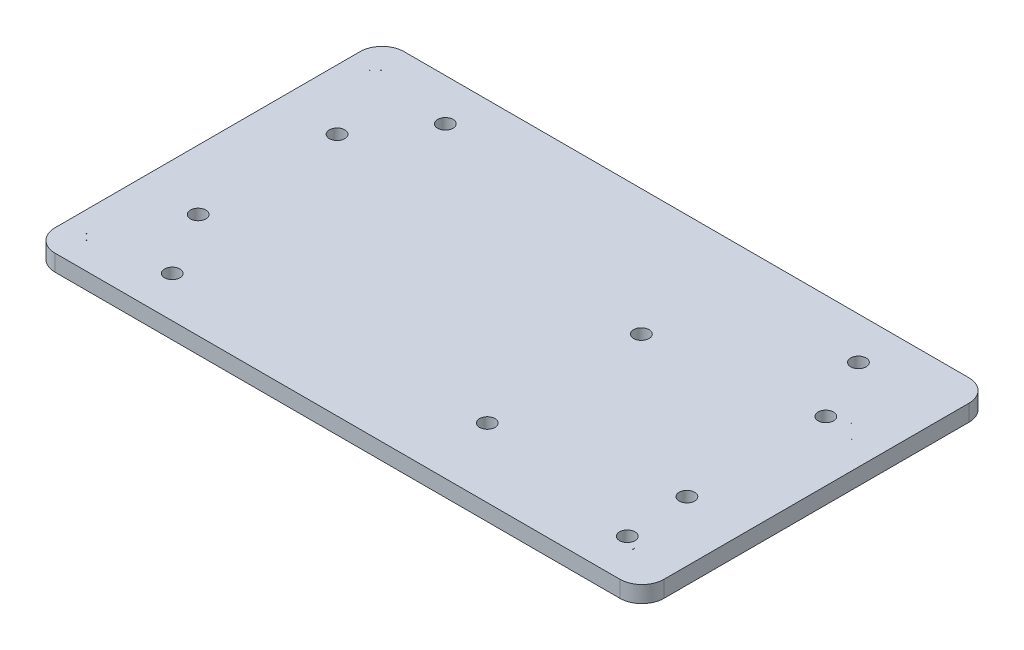
ISO-10303-21;
HEADER;
FILE_DESCRIPTION(('STEP AP214'),'2;1');
FILE_NAME('part.step','',(''),(''),'','','');
FILE_SCHEMA(('AUTOMOTIVE_DESIGN { 1 0 10303 214 1 1 1 1 }'));
ENDSEC;
DATA;
#1=APPLICATION_CONTEXT('core data for automotive mechanical design processes');
#2=APPLICATION_PROTOCOL_DEFINITION('international standard','automotive_design',2000,#1);
#3=PRODUCT_CONTEXT('',#1,'mechanical');
#4=PRODUCT('Part','Part','',(#3));
#5=PRODUCT_RELATED_PRODUCT_CATEGORY('part','',(#4));
#6=PRODUCT_DEFINITION_FORMATION('','',#4);
#7=PRODUCT_DEFINITION_CONTEXT('part definition',#1,'design');
#8=PRODUCT_DEFINITION('design','',#6,#7);
#9=PRODUCT_DEFINITION_SHAPE('','',#8);
#10=(LENGTH_UNIT() NAMED_UNIT(*) SI_UNIT(.MILLI.,.METRE.));
#11=(NAMED_UNIT(*) PLANE_ANGLE_UNIT() SI_UNIT($,.RADIAN.));
#12=(NAMED_UNIT(*) SI_UNIT($,.STERADIAN.) SOLID_ANGLE_UNIT());
#13=UNCERTAINTY_MEASURE_WITH_UNIT(LENGTH_MEASURE(1.E-05),#10,'distance_accuracy_value','');
#14=(GEOMETRIC_REPRESENTATION_CONTEXT(3) GLOBAL_UNCERTAINTY_ASSIGNED_CONTEXT((#13)) GLOBAL_UNIT_ASSIGNED_CONTEXT((#10,
#11,#12)) REPRESENTATION_CONTEXT('',''));
#15=CARTESIAN_POINT('',(0.,0.,0.));
#16=DIRECTION('',(0.,0.,1.));
#17=DIRECTION('',(1.,0.,0.));
#18=AXIS2_PLACEMENT_3D('',#15,#16,#17);
#19=CARTESIAN_POINT('',(-36.1275731391276,3.,0.));
#20=DIRECTION('',(1.,0.,0.));
#21=DIRECTION('',(0.,0.,-1.));
#22=AXIS2_PLACEMENT_3D('',#19,#20,#21);
#23=PLANE('',#22);
#24=DIRECTION('',(0.,0.,1.));
#25=VECTOR('',#24,1.);
#26=CARTESIAN_POINT('',(-36.1275731391276,0.,0.));
#27=LINE('',#26,#25);
#28=CARTESIAN_POINT('',(-36.1275731391276,0.,-87.0737122646059));
#29=VERTEX_POINT('',#28);
#30=CARTESIAN_POINT('',(-36.1275731391276,0.,-31.7737122646059));
#31=VERTEX_POINT('',#30);
#32=EDGE_CURVE('E260',#29,#31,#27,.T.);
#33=ORIENTED_EDGE('',*,*,#32,.T.);
#34=DIRECTION('',(0.,-1.,0.));
#35=VECTOR('',#34,1.);
#36=CARTESIAN_POINT('',(-36.1275731391276,3.,-31.7737122646059));
#37=LINE('',#36,#35);
#38=CARTESIAN_POINT('',(-36.1275731391276,3.,-31.7737122646059));
#39=VERTEX_POINT('',#38);
#40=EDGE_CURVE('E11',#39,#31,#37,.T.);
#41=ORIENTED_EDGE('',*,*,#40,.F.);
#42=DIRECTION('',(0.,0.,1.));
#43=VECTOR('',#42,1.);
#44=CARTESIAN_POINT('',(-36.1275731391276,3.,0.));
#45=LINE('',#44,#43);
#46=CARTESIAN_POINT('',(-36.1275731391276,3.,-87.0737122646059));
#47=VERTEX_POINT('',#46);
#48=EDGE_CURVE('E456',#47,#39,#45,.T.);
#49=ORIENTED_EDGE('',*,*,#48,.F.);
#50=DIRECTION('',(0.,-1.,0.));
#51=VECTOR('',#50,1.);
#52=CARTESIAN_POINT('',(-36.1275731391276,3.,-87.0737122646059));
#53=LINE('',#52,#51);
#54=EDGE_CURVE('E309',#47,#29,#53,.T.);
#55=ORIENTED_EDGE('',*,*,#54,.T.);
#56=EDGE_LOOP('',(#33,#41,#49,#55));
#57=FACE_BOUND('',#56,.T.);
#58=ADVANCED_FACE('F35',(#57),#23,.F.);
#59=CARTESIAN_POINT('',(-32.1275731391276,3.,-31.7737122646059));
#60=DIRECTION('',(0.,-1.,0.));
#61=DIRECTION('',(0.,0.,-1.));
#62=AXIS2_PLACEMENT_3D('',#59,#60,#61);
#63=CYLINDRICAL_SURFACE('',#62,4.00000000000001);
#64=CARTESIAN_POINT('',(-32.1275731391276,0.,-31.7737122646059));
#65=DIRECTION('',(0.,1.,0.));
#66=DIRECTION('',(0.,0.,1.));
#67=AXIS2_PLACEMENT_3D('',#64,#65,#66);
#68=CIRCLE('',#67,4.00000000000001);
#69=CARTESIAN_POINT('',(-32.1275731391276,0.,-27.7737122646059));
#70=VERTEX_POINT('',#69);
#71=EDGE_CURVE('E263',#31,#70,#68,.T.);
#72=ORIENTED_EDGE('',*,*,#71,.T.);
#73=DIRECTION('',(0.,-1.,0.));
#74=VECTOR('',#73,1.);
#75=CARTESIAN_POINT('',(-32.1275731391276,3.,-27.7737122646059));
#76=LINE('',#75,#74);
#77=CARTESIAN_POINT('',(-32.1275731391276,3.,-27.7737122646059));
#78=VERTEX_POINT('',#77);
#79=EDGE_CURVE('E45',#78,#70,#76,.T.);
#80=ORIENTED_EDGE('',*,*,#79,.F.);
#81=CARTESIAN_POINT('',(-32.1275731391276,3.,-31.7737122646059));
#82=DIRECTION('',(0.,1.,0.));
#83=DIRECTION('',(0.,0.,1.));
#84=AXIS2_PLACEMENT_3D('',#81,#82,#83);
#85=CIRCLE('',#84,4.00000000000001);
#86=EDGE_CURVE('E458',#39,#78,#85,.T.);
#87=ORIENTED_EDGE('',*,*,#86,.F.);
#88=ORIENTED_EDGE('',*,*,#40,.T.);
#89=EDGE_LOOP('',(#72,#80,#87,#88));
#90=FACE_BOUND('',#89,.T.);
#91=ADVANCED_FACE('F362',(#90),#63,.T.);
#92=CARTESIAN_POINT('',(0.,3.,-27.7737122646059));
#93=DIRECTION('',(0.,0.,1.));
#94=DIRECTION('',(1.,0.,0.));
#95=AXIS2_PLACEMENT_3D('',#92,#93,#94);
#96=PLANE('',#95);
#97=DIRECTION('',(-1.,0.,0.));
#98=VECTOR('',#97,1.);
#99=CARTESIAN_POINT('',(0.,0.,-27.7737122646059));
#100=LINE('',#99,#98);
#101=CARTESIAN_POINT('',(70.309170251969,0.,-27.7737122646059));
#102=VERTEX_POINT('',#101);
#103=EDGE_CURVE('E266',#102,#70,#100,.T.);
#104=ORIENTED_EDGE('',*,*,#103,.F.);
#105=DIRECTION('',(0.,-1.,0.));
#106=VECTOR('',#105,1.);
#107=CARTESIAN_POINT('',(70.309170251969,3.,-27.7737122646059));
#108=LINE('',#107,#106);
#109=CARTESIAN_POINT('',(70.309170251969,3.,-27.7737122646059));
#110=VERTEX_POINT('',#109);
#111=EDGE_CURVE('E316',#110,#102,#108,.T.);
#112=ORIENTED_EDGE('',*,*,#111,.F.);
#113=DIRECTION('',(-1.,0.,0.));
#114=VECTOR('',#113,1.);
#115=CARTESIAN_POINT('',(0.,3.,-27.7737122646059));
#116=LINE('',#115,#114);
#117=EDGE_CURVE('E460',#110,#78,#116,.T.);
#118=ORIENTED_EDGE('',*,*,#117,.T.);
#119=ORIENTED_EDGE('',*,*,#79,.T.);
#120=EDGE_LOOP('',(#104,#112,#118,#119));
#121=FACE_BOUND('',#120,.T.);
#122=ADVANCED_FACE('F368',(#121),#96,.T.);
#123=CARTESIAN_POINT('',(70.309170251969,3.,-31.7737122646059));
#124=DIRECTION('',(0.,-1.,0.));
#125=DIRECTION('',(0.,0.,-1.));
#126=AXIS2_PLACEMENT_3D('',#123,#124,#125);
#127=CYLINDRICAL_SURFACE('',#126,4.00000000000001);
#128=CARTESIAN_POINT('',(70.309170251969,0.,-31.7737122646059));
#129=DIRECTION('',(0.,1.,0.));
#130=DIRECTION('',(0.,0.,1.));
#131=AXIS2_PLACEMENT_3D('',#128,#129,#130);
#132=CIRCLE('',#131,4.00000000000001);
#133=CARTESIAN_POINT('',(74.309170251969,0.,-31.7737122646059));
#134=VERTEX_POINT('',#133);
#135=EDGE_CURVE('E269',#102,#134,#132,.T.);
#136=ORIENTED_EDGE('',*,*,#135,.T.);
#137=DIRECTION('',(0.,-1.,0.));
#138=VECTOR('',#137,1.);
#139=CARTESIAN_POINT('',(74.309170251969,3.,-31.7737122646059));
#140=LINE('',#139,#138);
#141=CARTESIAN_POINT('',(74.309170251969,3.,-31.7737122646059));
#142=VERTEX_POINT('',#141);
#143=EDGE_CURVE('E314',#142,#134,#140,.T.);
#144=ORIENTED_EDGE('',*,*,#143,.F.);
#145=CARTESIAN_POINT('',(70.309170251969,3.,-31.7737122646059));
#146=DIRECTION('',(0.,1.,0.));
#147=DIRECTION('',(0.,0.,1.));
#148=AXIS2_PLACEMENT_3D('',#145,#146,#147);
#149=CIRCLE('',#148,4.00000000000001);
#150=EDGE_CURVE('E463',#110,#142,#149,.T.);
#151=ORIENTED_EDGE('',*,*,#150,.F.);
#152=ORIENTED_EDGE('',*,*,#111,.T.);
#153=EDGE_LOOP('',(#136,#144,#151,#152));
#154=FACE_BOUND('',#153,.T.);
#155=ADVANCED_FACE('F491',(#154),#127,.T.);
#156=CARTESIAN_POINT('',(74.309170251969,3.,0.));
#157=DIRECTION('',(1.,0.,0.));
#158=DIRECTION('',(0.,0.,-1.));
#159=AXIS2_PLACEMENT_3D('',#156,#157,#158);
#160=PLANE('',#159);
#161=DIRECTION('',(0.,0.,1.));
#162=VECTOR('',#161,1.);
#163=CARTESIAN_POINT('',(74.309170251969,0.,0.));
#164=LINE('',#163,#162);
#165=CARTESIAN_POINT('',(74.309170251969,0.,-87.0737122646059));
#166=VERTEX_POINT('',#165);
#167=EDGE_CURVE('E272',#166,#134,#164,.T.);
#168=ORIENTED_EDGE('',*,*,#167,.F.);
#169=DIRECTION('',(0.,-1.,0.));
#170=VECTOR('',#169,1.);
#171=CARTESIAN_POINT('',(74.309170251969,3.,-87.0737122646059));
#172=LINE('',#171,#170);
#173=CARTESIAN_POINT('',(74.309170251969,3.,-87.0737122646059));
#174=VERTEX_POINT('',#173);
#175=EDGE_CURVE('E180',#174,#166,#172,.T.);
#176=ORIENTED_EDGE('',*,*,#175,.F.);
#177=DIRECTION('',(0.,0.,1.));
#178=VECTOR('',#177,1.);
#179=CARTESIAN_POINT('',(74.309170251969,3.,0.));
#180=LINE('',#179,#178);
#181=EDGE_CURVE('E173',#174,#142,#180,.T.);
#182=ORIENTED_EDGE('',*,*,#181,.T.);
#183=ORIENTED_EDGE('',*,*,#143,.T.);
#184=EDGE_LOOP('',(#168,#176,#182,#183));
#185=FACE_BOUND('',#184,.T.);
#186=ADVANCED_FACE('F466',(#185),#160,.T.);
#187=CARTESIAN_POINT('',(70.309170251969,3.,-87.0737122646059));
#188=DIRECTION('',(0.,-1.,0.));
#189=DIRECTION('',(0.,0.,-1.));
#190=AXIS2_PLACEMENT_3D('',#187,#188,#189);
#191=CYLINDRICAL_SURFACE('',#190,4.00000000000001);
#192=CARTESIAN_POINT('',(70.309170251969,0.,-87.0737122646059));
#193=DIRECTION('',(0.,1.,0.));
#194=DIRECTION('',(0.,0.,1.));
#195=AXIS2_PLACEMENT_3D('',#192,#193,#194);
#196=CIRCLE('',#195,4.00000000000001);
#197=CARTESIAN_POINT('',(70.309170251969,0.,-91.0737122646059));
#198=VERTEX_POINT('',#197);
#199=EDGE_CURVE('E179',#166,#198,#196,.T.);
#200=ORIENTED_EDGE('',*,*,#199,.T.);
#201=DIRECTION('',(0.,-1.,0.));
#202=VECTOR('',#201,1.);
#203=CARTESIAN_POINT('',(70.309170251969,3.,-91.0737122646059));
#204=LINE('',#203,#202);
#205=CARTESIAN_POINT('',(70.309170251969,3.,-91.0737122646059));
#206=VERTEX_POINT('',#205);
#207=EDGE_CURVE('E176',#206,#198,#204,.T.);
#208=ORIENTED_EDGE('',*,*,#207,.F.);
#209=CARTESIAN_POINT('',(70.309170251969,3.,-87.0737122646059));
#210=DIRECTION('',(0.,1.,0.));
#211=DIRECTION('',(0.,0.,1.));
#212=AXIS2_PLACEMENT_3D('',#209,#210,#211);
#213=CIRCLE('',#212,4.00000000000001);
#214=EDGE_CURVE('E166',#174,#206,#213,.T.);
#215=ORIENTED_EDGE('',*,*,#214,.F.);
#216=ORIENTED_EDGE('',*,*,#175,.T.);
#217=EDGE_LOOP('',(#200,#208,#215,#216));
#218=FACE_BOUND('',#217,.T.);
#219=ADVANCED_FACE('F177',(#218),#191,.T.);
#220=CARTESIAN_POINT('',(0.,3.,-91.0737122646059));
#221=DIRECTION('',(0.,0.,1.));
#222=DIRECTION('',(1.,0.,0.));
#223=AXIS2_PLACEMENT_3D('',#220,#221,#222);
#224=PLANE('',#223);
#225=DIRECTION('',(-1.,0.,0.));
#226=VECTOR('',#225,1.);
#227=CARTESIAN_POINT('',(0.,0.,-91.0737122646059));
#228=LINE('',#227,#226);
#229=CARTESIAN_POINT('',(-32.1275731391276,0.,-91.0737122646059));
#230=VERTEX_POINT('',#229);
#231=EDGE_CURVE('E110',#198,#230,#228,.T.);
#232=ORIENTED_EDGE('',*,*,#231,.T.);
#233=DIRECTION('',(0.,-1.,0.));
#234=VECTOR('',#233,1.);
#235=CARTESIAN_POINT('',(-32.1275731391276,3.,-91.0737122646059));
#236=LINE('',#235,#234);
#237=CARTESIAN_POINT('',(-32.1275731391276,3.,-91.0737122646059));
#238=VERTEX_POINT('',#237);
#239=EDGE_CURVE('E181',#238,#230,#236,.T.);
#240=ORIENTED_EDGE('',*,*,#239,.F.);
#241=DIRECTION('',(-1.,0.,0.));
#242=VECTOR('',#241,1.);
#243=CARTESIAN_POINT('',(0.,3.,-91.0737122646059));
#244=LINE('',#243,#242);
#245=EDGE_CURVE('E171',#206,#238,#244,.T.);
#246=ORIENTED_EDGE('',*,*,#245,.F.);
#247=ORIENTED_EDGE('',*,*,#207,.T.);
#248=EDGE_LOOP('',(#232,#240,#246,#247));
#249=FACE_BOUND('',#248,.T.);
#250=ADVANCED_FACE('F183',(#249),#224,.F.);
#251=CARTESIAN_POINT('',(66.7600815564872,3.,-33.9324664266506));
#252=DIRECTION('',(0.,-1.,0.));
#253=DIRECTION('',(0.,0.,-1.));
#254=AXIS2_PLACEMENT_3D('',#251,#252,#253);
#255=CYLINDRICAL_SURFACE('',#254,0.0634981889505305);
#256=CARTESIAN_POINT('',(66.7600815564872,0.,-33.9324664266506));
#257=DIRECTION('',(0.,1.,0.));
#258=DIRECTION('',(0.,0.,1.));
#259=AXIS2_PLACEMENT_3D('',#256,#257,#258);
#260=CIRCLE('',#259,0.0634981889505305);
#261=CARTESIAN_POINT('',(66.8049906731604,0.,-33.9773598698203));
#262=VERTEX_POINT('',#261);
#263=CARTESIAN_POINT('',(66.7600704739626,0.,-33.8689682386672));
#264=VERTEX_POINT('',#263);
#265=EDGE_CURVE('E236',#262,#264,#260,.T.);
#266=ORIENTED_EDGE('',*,*,#265,.F.);
#267=DIRECTION('',(0.,-1.,0.));
#268=VECTOR('',#267,1.);
#269=CARTESIAN_POINT('',(66.8049906731604,3.,-33.9773598698203));
#270=LINE('',#269,#268);
#271=CARTESIAN_POINT('',(66.8049906731604,3.,-33.9773598698203));
#272=VERTEX_POINT('',#271);
#273=EDGE_CURVE('E311',#272,#262,#270,.T.);
#274=ORIENTED_EDGE('',*,*,#273,.F.);
#275=CARTESIAN_POINT('',(66.7600815564872,3.,-33.9324664266506));
#276=DIRECTION('',(0.,1.,0.));
#277=DIRECTION('',(0.,0.,1.));
#278=AXIS2_PLACEMENT_3D('',#275,#276,#277);
#279=CIRCLE('',#278,0.0634981889505305);
#280=CARTESIAN_POINT('',(66.7600704739626,3.,-33.8689682386672));
#281=VERTEX_POINT('',#280);
#282=EDGE_CURVE('E428',#272,#281,#279,.T.);
#283=ORIENTED_EDGE('',*,*,#282,.T.);
#284=DIRECTION('',(0.,-1.,0.));
#285=VECTOR('',#284,1.);
#286=CARTESIAN_POINT('',(66.7600704739626,3.,-33.8689682386672));
#287=LINE('',#286,#285);
#288=EDGE_CURVE('E319',#281,#264,#287,.T.);
#289=ORIENTED_EDGE('',*,*,#288,.T.);
#290=EDGE_LOOP('',(#266,#274,#283,#289));
#291=FACE_BOUND('',#290,.T.);
#292=ADVANCED_FACE('F401',(#291),#255,.F.);
#293=CARTESIAN_POINT('',(16.4021567664769,3.,16.4078831987858));
#294=DIRECTION('',(0.706983357002379,0.,0.707230183831012));
#295=DIRECTION('',(0.707230183831012,0.,-0.706983357002379));
#296=AXIS2_PLACEMENT_3D('',#293,#294,#295);
#297=PLANE('',#296);
#298=DIRECTION('',(-0.707230183831012,0.,0.706983357002379));
#299=VECTOR('',#298,1.);
#300=CARTESIAN_POINT('',(16.4021567664769,0.,16.4078831987858));
#301=LINE('',#300,#299);
#302=CARTESIAN_POINT('',(66.7600815564872,0.,-33.9324664266506));
#303=VERTEX_POINT('',#302);
#304=EDGE_CURVE('E239',#262,#303,#301,.T.);
#305=ORIENTED_EDGE('',*,*,#304,.T.);
#306=DIRECTION('',(0.,-1.,0.));
#307=VECTOR('',#306,1.);
#308=CARTESIAN_POINT('',(66.7600815564872,3.,-33.9324664266506));
#309=LINE('',#308,#307);
#310=CARTESIAN_POINT('',(66.7600815564872,3.,-33.9324664266506));
#311=VERTEX_POINT('',#310);
#312=EDGE_CURVE('E321',#311,#303,#309,.T.);
#313=ORIENTED_EDGE('',*,*,#312,.F.);
#314=DIRECTION('',(-0.707230183831012,0.,0.706983357002379));
#315=VECTOR('',#314,1.);
#316=CARTESIAN_POINT('',(16.4021567664769,3.,16.4078831987858));
#317=LINE('',#316,#315);
#318=EDGE_CURVE('E436',#272,#311,#317,.T.);
#319=ORIENTED_EDGE('',*,*,#318,.F.);
#320=ORIENTED_EDGE('',*,*,#273,.T.);
#321=EDGE_LOOP('',(#305,#313,#319,#320));
#322=FACE_BOUND('',#321,.T.);
#323=ADVANCED_FACE('F397',(#322),#297,.F.);
#324=CARTESIAN_POINT('',(70.0463601708071,3.,-70.0219136450005));
#325=DIRECTION('',(0.707230183831026,0.,-0.706983357002365));
#326=DIRECTION('',(-0.706983357002365,0.,-0.707230183831026));
#327=AXIS2_PLACEMENT_3D('',#324,#325,#326);
#328=PLANE('',#327);
#329=DIRECTION('',(0.706983357002365,0.,0.707230183831026));
#330=VECTOR('',#329,1.);
#331=CARTESIAN_POINT('',(70.0463601708071,0.,-70.0219136450005));
#332=LINE('',#331,#330);
#333=CARTESIAN_POINT('',(69.2616161222335,0.,-70.8069316687432));
#334=VERTEX_POINT('',#333);
#335=CARTESIAN_POINT('',(69.3065095654032,0.,-70.7620225520699));
#336=VERTEX_POINT('',#335);
#337=EDGE_CURVE('E227',#334,#336,#332,.T.);
#338=ORIENTED_EDGE('',*,*,#337,.F.);
#339=DIRECTION('',(0.,-1.,0.));
#340=VECTOR('',#339,1.);
#341=CARTESIAN_POINT('',(69.2616161222335,3.,-70.8069316687432));
#342=LINE('',#341,#340);
#343=CARTESIAN_POINT('',(69.2616161222335,3.,-70.8069316687432));
#344=VERTEX_POINT('',#343);
#345=EDGE_CURVE('E322',#344,#334,#342,.T.);
#346=ORIENTED_EDGE('',*,*,#345,.F.);
#347=DIRECTION('',(0.706983357002365,0.,0.707230183831026));
#348=VECTOR('',#347,1.);
#349=CARTESIAN_POINT('',(70.0463601708071,3.,-70.0219136450005));
#350=LINE('',#349,#348);
#351=CARTESIAN_POINT('',(69.3065095654032,3.,-70.7620225520699));
#352=VERTEX_POINT('',#351);
#353=EDGE_CURVE('E426',#344,#352,#350,.T.);
#354=ORIENTED_EDGE('',*,*,#353,.T.);
#355=DIRECTION('',(0.,-1.,0.));
#356=VECTOR('',#355,1.);
#357=CARTESIAN_POINT('',(69.3065095654032,3.,-70.7620225520699));
#358=LINE('',#357,#356);
#359=EDGE_CURVE('E326',#352,#336,#358,.T.);
#360=ORIENTED_EDGE('',*,*,#359,.T.);
#361=EDGE_LOOP('',(#338,#346,#354,#360));
#362=FACE_BOUND('',#361,.T.);
#363=ADVANCED_FACE('F400',(#362),#328,.T.);
#364=CARTESIAN_POINT('',(69.3065095654032,3.,-70.7620225520699));
#365=DIRECTION('',(0.,-1.,0.));
#366=DIRECTION('',(0.,0.,-1.));
#367=AXIS2_PLACEMENT_3D('',#364,#365,#366);
#368=CYLINDRICAL_SURFACE('',#367,0.0635000000000044);
#369=CARTESIAN_POINT('',(69.3065095654032,0.,-70.7620225520699));
#370=DIRECTION('',(0.,1.,0.));
#371=DIRECTION('',(0.,0.,1.));
#372=AXIS2_PLACEMENT_3D('',#369,#370,#371);
#373=CIRCLE('',#372,0.0635000000000044);
#374=CARTESIAN_POINT('',(69.3064984828786,0.,-70.6985243640865));
#375=VERTEX_POINT('',#374);
#376=EDGE_CURVE('E230',#375,#334,#373,.T.);
#377=ORIENTED_EDGE('',*,*,#376,.F.);
#378=DIRECTION('',(0.,-1.,0.));
#379=VECTOR('',#378,1.);
#380=CARTESIAN_POINT('',(69.3064984828786,3.,-70.6985243640865));
#381=LINE('',#380,#379);
#382=CARTESIAN_POINT('',(69.3064984828786,3.,-70.6985243640865));
#383=VERTEX_POINT('',#382);
#384=EDGE_CURVE('E328',#383,#375,#381,.T.);
#385=ORIENTED_EDGE('',*,*,#384,.F.);
#386=CARTESIAN_POINT('',(69.3065095654032,3.,-70.7620225520699));
#387=DIRECTION('',(0.,1.,0.));
#388=DIRECTION('',(0.,0.,1.));
#389=AXIS2_PLACEMENT_3D('',#386,#387,#388);
#390=CIRCLE('',#389,0.0635000000000044);
#391=EDGE_CURVE('E421',#383,#344,#390,.T.);
#392=ORIENTED_EDGE('',*,*,#391,.T.);
#393=ORIENTED_EDGE('',*,*,#345,.T.);
#394=EDGE_LOOP('',(#377,#385,#392,#393));
#395=FACE_BOUND('',#394,.T.);
#396=ADVANCED_FACE('F406',(#395),#368,.F.);
#397=CARTESIAN_POINT('',(66.7669529177174,3.,-73.3024658270113));
#398=DIRECTION('',(0.,-1.,0.));
#399=DIRECTION('',(0.,0.,-1.));
#400=AXIS2_PLACEMENT_3D('',#397,#398,#399);
#401=CYLINDRICAL_SURFACE('',#400,0.0635000000000044);
#402=CARTESIAN_POINT('',(66.7669529177174,0.,-73.3024658270113));
#403=DIRECTION('',(0.,1.,0.));
#404=DIRECTION('',(0.,0.,1.));
#405=AXIS2_PLACEMENT_3D('',#402,#403,#404);
#406=CIRCLE('',#405,0.0635000000000044);
#407=CARTESIAN_POINT('',(66.766964000242,0.,-73.3659640149946));
#408=VERTEX_POINT('',#407);
#409=CARTESIAN_POINT('',(66.8118463608871,0.,-73.257556710338));
#410=VERTEX_POINT('',#409);
#411=EDGE_CURVE('E219',#408,#410,#406,.T.);
#412=ORIENTED_EDGE('',*,*,#411,.F.);
#413=DIRECTION('',(0.,-1.,0.));
#414=VECTOR('',#413,1.);
#415=CARTESIAN_POINT('',(66.766964000242,3.,-73.3659640149946));
#416=LINE('',#415,#414);
#417=CARTESIAN_POINT('',(66.766964000242,3.,-73.3659640149946));
#418=VERTEX_POINT('',#417);
#419=EDGE_CURVE('E39',#418,#408,#416,.T.);
#420=ORIENTED_EDGE('',*,*,#419,.F.);
#421=CARTESIAN_POINT('',(66.7669529177174,3.,-73.3024658270113));
#422=DIRECTION('',(0.,1.,0.));
#423=DIRECTION('',(0.,0.,1.));
#424=AXIS2_PLACEMENT_3D('',#421,#422,#423);
#425=CIRCLE('',#424,0.0635000000000044);
#426=CARTESIAN_POINT('',(66.8118463608871,3.,-73.257556710338));
#427=VERTEX_POINT('',#426);
#428=EDGE_CURVE('E308',#418,#427,#425,.T.);
#429=ORIENTED_EDGE('',*,*,#428,.T.);
#430=DIRECTION('',(0.,-1.,0.));
#431=VECTOR('',#430,1.);
#432=CARTESIAN_POINT('',(66.8118463608871,3.,-73.257556710338));
#433=LINE('',#432,#431);
#434=EDGE_CURVE('E218',#427,#410,#433,.T.);
#435=ORIENTED_EDGE('',*,*,#434,.T.);
#436=EDGE_LOOP('',(#412,#420,#429,#435));
#437=FACE_BOUND('',#436,.T.);
#438=ADVANCED_FACE('F37',(#437),#401,.F.);
#439=CARTESIAN_POINT('',(66.7541571903545,3.,0.0116507984419332));
#440=DIRECTION('',(0.999999984769129,0.,0.000174532924312988));
#441=DIRECTION('',(0.000174532924312988,0.,-0.999999984769129));
#442=AXIS2_PLACEMENT_3D('',#439,#440,#441);
#443=PLANE('',#442);
#444=DIRECTION('',(-0.000174532924312988,0.,0.999999984769129));
#445=VECTOR('',#444,1.);
#446=CARTESIAN_POINT('',(66.7541571903545,0.,0.0116507984419332));
#447=LINE('',#446,#445);
#448=CARTESIAN_POINT('',(66.7669529177174,0.,-73.3024658270113));
#449=VERTEX_POINT('',#448);
#450=EDGE_CURVE('E222',#408,#449,#447,.T.);
#451=ORIENTED_EDGE('',*,*,#450,.T.);
#452=DIRECTION('',(0.,-1.,0.));
#453=VECTOR('',#452,1.);
#454=CARTESIAN_POINT('',(66.7669529177174,3.,-73.3024658270113));
#455=LINE('',#454,#453);
#456=CARTESIAN_POINT('',(66.7669529177174,3.,-73.3024658270113));
#457=VERTEX_POINT('',#456);
#458=EDGE_CURVE('E331',#457,#449,#455,.T.);
#459=ORIENTED_EDGE('',*,*,#458,.F.);
#460=DIRECTION('',(-0.000174532924312988,0.,0.999999984769129));
#461=VECTOR('',#460,1.);
#462=CARTESIAN_POINT('',(66.7541571903545,3.,0.0116507984419332));
#463=LINE('',#462,#461);
#464=EDGE_CURVE('E340',#418,#457,#463,.T.);
#465=ORIENTED_EDGE('',*,*,#464,.F.);
#466=ORIENTED_EDGE('',*,*,#419,.T.);
#467=EDGE_LOOP('',(#451,#459,#465,#466));
#468=FACE_BOUND('',#467,.T.);
#469=ADVANCED_FACE('F339',(#468),#443,.F.);
#470=CARTESIAN_POINT('',(63.409170251969,3.,-46.8237122646059));
#471=DIRECTION('',(0.,-1.,0.));
#472=DIRECTION('',(0.,0.,-1.));
#473=AXIS2_PLACEMENT_3D('',#470,#471,#472);
#474=CYLINDRICAL_SURFACE('',#473,1.4);
#475=CARTESIAN_POINT('',(63.409170251969,3.,-46.8237122646059));
#476=DIRECTION('',(0.,1.,0.));
#477=DIRECTION('',(0.,0.,1.));
#478=AXIS2_PLACEMENT_3D('',#475,#476,#477);
#479=CIRCLE('',#478,1.4);
#480=CARTESIAN_POINT('',(63.409170251969,3.,-45.4237122646059));
#481=VERTEX_POINT('',#480);
#482=EDGE_CURVE('E212',#481,#481,#479,.T.);
#483=ORIENTED_EDGE('',*,*,#482,.T.);
#484=EDGE_LOOP('',(#483));
#485=FACE_BOUND('',#484,.T.);
#486=CARTESIAN_POINT('',(63.409170251969,0.,-46.8237122646059));
#487=DIRECTION('',(0.,1.,0.));
#488=DIRECTION('',(0.,0.,1.));
#489=AXIS2_PLACEMENT_3D('',#486,#487,#488);
#490=CIRCLE('',#489,1.4);
#491=CARTESIAN_POINT('',(63.409170251969,0.,-45.4237122646059));
#492=VERTEX_POINT('',#491);
#493=EDGE_CURVE('E302',#492,#492,#490,.T.);
#494=ORIENTED_EDGE('',*,*,#493,.F.);
#495=EDGE_LOOP('',(#494));
#496=FACE_BOUND('',#495,.T.);
#497=ADVANCED_FACE('F556',(#485,#496),#474,.F.);
#498=CARTESIAN_POINT('',(-25.2275731391276,3.,-72.0237122646059));
#499=DIRECTION('',(0.,-1.,0.));
#500=DIRECTION('',(0.,0.,-1.));
#501=AXIS2_PLACEMENT_3D('',#498,#499,#500);
#502=CYLINDRICAL_SURFACE('',#501,1.4);
#503=CARTESIAN_POINT('',(-25.2275731391276,3.,-72.0237122646059));
#504=DIRECTION('',(0.,1.,0.));
#505=DIRECTION('',(0.,0.,1.));
#506=AXIS2_PLACEMENT_3D('',#503,#504,#505);
#507=CIRCLE('',#506,1.4);
#508=CARTESIAN_POINT('',(-25.2275731391276,3.,-70.623712264606));
#509=VERTEX_POINT('',#508);
#510=EDGE_CURVE('E209',#509,#509,#507,.T.);
#511=ORIENTED_EDGE('',*,*,#510,.T.);
#512=EDGE_LOOP('',(#511));
#513=FACE_BOUND('',#512,.T.);
#514=CARTESIAN_POINT('',(-25.2275731391276,0.,-72.0237122646059));
#515=DIRECTION('',(0.,1.,0.));
#516=DIRECTION('',(0.,0.,1.));
#517=AXIS2_PLACEMENT_3D('',#514,#515,#516);
#518=CIRCLE('',#517,1.4);
#519=CARTESIAN_POINT('',(-25.2275731391276,0.,-70.623712264606));
#520=VERTEX_POINT('',#519);
#521=EDGE_CURVE('E299',#520,#520,#518,.T.);
#522=ORIENTED_EDGE('',*,*,#521,.F.);
#523=EDGE_LOOP('',(#522));
#524=FACE_BOUND('',#523,.T.);
#525=ADVANCED_FACE('F564',(#513,#524),#502,.F.);
#526=CARTESIAN_POINT('',(-25.2275731391276,3.,-46.8237122646059));
#527=DIRECTION('',(0.,-1.,0.));
#528=DIRECTION('',(0.,0.,-1.));
#529=AXIS2_PLACEMENT_3D('',#526,#527,#528);
#530=CYLINDRICAL_SURFACE('',#529,1.4);
#531=CARTESIAN_POINT('',(-25.2275731391276,3.,-46.8237122646059));
#532=DIRECTION('',(0.,1.,0.));
#533=DIRECTION('',(0.,0.,1.));
#534=AXIS2_PLACEMENT_3D('',#531,#532,#533);
#535=CIRCLE('',#534,1.4);
#536=CARTESIAN_POINT('',(-25.2275731391276,3.,-45.4237122646059));
#537=VERTEX_POINT('',#536);
#538=EDGE_CURVE('E206',#537,#537,#535,.T.);
#539=ORIENTED_EDGE('',*,*,#538,.T.);
#540=EDGE_LOOP('',(#539));
#541=FACE_BOUND('',#540,.T.);
#542=CARTESIAN_POINT('',(-25.2275731391276,0.,-46.8237122646059));
#543=DIRECTION('',(0.,1.,0.));
#544=DIRECTION('',(0.,0.,1.));
#545=AXIS2_PLACEMENT_3D('',#542,#543,#544);
#546=CIRCLE('',#545,1.4);
#547=CARTESIAN_POINT('',(-25.2275731391276,0.,-45.4237122646059));
#548=VERTEX_POINT('',#547);
#549=EDGE_CURVE('E296',#548,#548,#546,.T.);
#550=ORIENTED_EDGE('',*,*,#549,.F.);
#551=EDGE_LOOP('',(#550));
#552=FACE_BOUND('',#551,.T.);
#553=ADVANCED_FACE('F574',(#541,#552),#530,.F.);
#554=CARTESIAN_POINT('',(-17.05127255112,3.,-83.4770950219816));
#555=DIRECTION('',(0.,-1.,0.));
#556=DIRECTION('',(0.,0.,-1.));
#557=AXIS2_PLACEMENT_3D('',#554,#555,#556);
#558=CYLINDRICAL_SURFACE('',#557,1.4);
#559=CARTESIAN_POINT('',(-17.05127255112,3.,-83.4770950219816));
#560=DIRECTION('',(0.,1.,0.));
#561=DIRECTION('',(0.,0.,1.));
#562=AXIS2_PLACEMENT_3D('',#559,#560,#561);
#563=CIRCLE('',#562,1.4);
#564=CARTESIAN_POINT('',(-17.05127255112,3.,-82.0770950219816));
#565=VERTEX_POINT('',#564);
#566=EDGE_CURVE('E203',#565,#565,#563,.T.);
#567=ORIENTED_EDGE('',*,*,#566,.T.);
#568=EDGE_LOOP('',(#567));
#569=FACE_BOUND('',#568,.T.);
#570=CARTESIAN_POINT('',(-17.05127255112,0.,-83.4770950219816));
#571=DIRECTION('',(0.,1.,0.));
#572=DIRECTION('',(0.,0.,1.));
#573=AXIS2_PLACEMENT_3D('',#570,#571,#572);
#574=CIRCLE('',#573,1.4);
#575=CARTESIAN_POINT('',(-17.05127255112,0.,-82.0770950219816));
#576=VERTEX_POINT('',#575);
#577=EDGE_CURVE('E293',#576,#576,#574,.T.);
#578=ORIENTED_EDGE('',*,*,#577,.F.);
#579=EDGE_LOOP('',(#578));
#580=FACE_BOUND('',#579,.T.);
#581=ADVANCED_FACE('F584',(#569,#580),#558,.F.);
#582=CARTESIAN_POINT('',(-18.3296954907042,3.,-35.2173174138372));
#583=DIRECTION('',(0.,-1.,0.));
#584=DIRECTION('',(0.,0.,-1.));
#585=AXIS2_PLACEMENT_3D('',#582,#583,#584);
#586=CYLINDRICAL_SURFACE('',#585,1.4);
#587=CARTESIAN_POINT('',(-18.3296954907042,3.,-35.2173174138372));
#588=DIRECTION('',(0.,1.,0.));
#589=DIRECTION('',(0.,0.,1.));
#590=AXIS2_PLACEMENT_3D('',#587,#588,#589);
#591=CIRCLE('',#590,1.4);
#592=CARTESIAN_POINT('',(-18.3296954907042,3.,-33.8173174138372));
#593=VERTEX_POINT('',#592);
#594=EDGE_CURVE('E200',#593,#593,#591,.T.);
#595=ORIENTED_EDGE('',*,*,#594,.T.);
#596=EDGE_LOOP('',(#595));
#597=FACE_BOUND('',#596,.T.);
#598=CARTESIAN_POINT('',(-18.3296954907042,0.,-35.2173174138372));
#599=DIRECTION('',(0.,1.,0.));
#600=DIRECTION('',(0.,0.,1.));
#601=AXIS2_PLACEMENT_3D('',#598,#599,#600);
#602=CIRCLE('',#601,1.4);
#603=CARTESIAN_POINT('',(-18.3296954907042,0.,-33.8173174138372));
#604=VERTEX_POINT('',#603);
#605=EDGE_CURVE('E290',#604,#604,#602,.T.);
#606=ORIENTED_EDGE('',*,*,#605,.F.);
#607=EDGE_LOOP('',(#606));
#608=FACE_BOUND('',#607,.T.);
#609=ADVANCED_FACE('F594',(#597,#608),#586,.F.);
#610=CARTESIAN_POINT('',(33.7460667933852,3.,-68.2282289815449));
#611=DIRECTION('',(0.,-1.,0.));
#612=DIRECTION('',(0.,0.,-1.));
#613=AXIS2_PLACEMENT_3D('',#610,#611,#612);
#614=CYLINDRICAL_SURFACE('',#613,1.4);
#615=CARTESIAN_POINT('',(33.7460667933852,3.,-68.2282289815449));
#616=DIRECTION('',(0.,1.,0.));
#617=DIRECTION('',(0.,0.,1.));
#618=AXIS2_PLACEMENT_3D('',#615,#616,#617);
#619=CIRCLE('',#618,1.4);
#620=CARTESIAN_POINT('',(33.7460667933852,3.,-66.8282289815449));
#621=VERTEX_POINT('',#620);
#622=EDGE_CURVE('E197',#621,#621,#619,.T.);
#623=ORIENTED_EDGE('',*,*,#622,.T.);
#624=EDGE_LOOP('',(#623));
#625=FACE_BOUND('',#624,.T.);
#626=CARTESIAN_POINT('',(33.7460667933852,0.,-68.2282289815449));
#627=DIRECTION('',(0.,1.,0.));
#628=DIRECTION('',(0.,0.,1.));
#629=AXIS2_PLACEMENT_3D('',#626,#627,#628);
#630=CIRCLE('',#629,1.4);
#631=CARTESIAN_POINT('',(33.7460667933852,0.,-66.8282289815449));
#632=VERTEX_POINT('',#631);
#633=EDGE_CURVE('E287',#632,#632,#630,.T.);
#634=ORIENTED_EDGE('',*,*,#633,.F.);
#635=EDGE_LOOP('',(#634));
#636=FACE_BOUND('',#635,.T.);
#637=ADVANCED_FACE('F604',(#625,#636),#614,.F.);
#638=CARTESIAN_POINT('',(33.7411903434799,3.,-40.2882294070954));
#639=DIRECTION('',(0.,-1.,0.));
#640=DIRECTION('',(0.,0.,-1.));
#641=AXIS2_PLACEMENT_3D('',#638,#639,#640);
#642=CYLINDRICAL_SURFACE('',#641,1.4);
#643=CARTESIAN_POINT('',(33.7411903434799,3.,-40.2882294070954));
#644=DIRECTION('',(0.,1.,0.));
#645=DIRECTION('',(0.,0.,1.));
#646=AXIS2_PLACEMENT_3D('',#643,#644,#645);
#647=CIRCLE('',#646,1.4);
#648=CARTESIAN_POINT('',(33.7411903434799,3.,-38.8882294070954));
#649=VERTEX_POINT('',#648);
#650=EDGE_CURVE('E194',#649,#649,#647,.T.);
#651=ORIENTED_EDGE('',*,*,#650,.T.);
#652=EDGE_LOOP('',(#651));
#653=FACE_BOUND('',#652,.T.);
#654=CARTESIAN_POINT('',(33.7411903434799,0.,-40.2882294070954));
#655=DIRECTION('',(0.,1.,0.));
#656=DIRECTION('',(0.,0.,1.));
#657=AXIS2_PLACEMENT_3D('',#654,#655,#656);
#658=CIRCLE('',#657,1.4);
#659=CARTESIAN_POINT('',(33.7411903434799,0.,-38.8882294070954));
#660=VERTEX_POINT('',#659);
#661=EDGE_CURVE('E284',#660,#660,#658,.T.);
#662=ORIENTED_EDGE('',*,*,#661,.F.);
#663=EDGE_LOOP('',(#662));
#664=FACE_BOUND('',#663,.T.);
#665=ADVANCED_FACE('F614',(#653,#664),#642,.F.);
#666=CARTESIAN_POINT('',(57.8787263076308,3.,-83.4640172699628));
#667=DIRECTION('',(0.,-1.,0.));
#668=DIRECTION('',(0.,0.,-1.));
#669=AXIS2_PLACEMENT_3D('',#666,#667,#668);
#670=CYLINDRICAL_SURFACE('',#669,1.40000000000001);
#671=CARTESIAN_POINT('',(57.8787263076308,3.,-83.4640172699628));
#672=DIRECTION('',(0.,1.,0.));
#673=DIRECTION('',(0.,0.,1.));
#674=AXIS2_PLACEMENT_3D('',#671,#672,#673);
#675=CIRCLE('',#674,1.40000000000001);
#676=CARTESIAN_POINT('',(57.8787263076308,3.,-82.0640172699627));
#677=VERTEX_POINT('',#676);
#678=EDGE_CURVE('E191',#677,#677,#675,.T.);
#679=ORIENTED_EDGE('',*,*,#678,.T.);
#680=EDGE_LOOP('',(#679));
#681=FACE_BOUND('',#680,.T.);
#682=CARTESIAN_POINT('',(57.8787263076308,0.,-83.4640172699628));
#683=DIRECTION('',(0.,1.,0.));
#684=DIRECTION('',(0.,0.,1.));
#685=AXIS2_PLACEMENT_3D('',#682,#683,#684);
#686=CIRCLE('',#685,1.40000000000001);
#687=CARTESIAN_POINT('',(57.8787263076308,0.,-82.0640172699627));
#688=VERTEX_POINT('',#687);
#689=EDGE_CURVE('E281',#688,#688,#686,.T.);
#690=ORIENTED_EDGE('',*,*,#689,.F.);
#691=EDGE_LOOP('',(#690));
#692=FACE_BOUND('',#691,.T.);
#693=ADVANCED_FACE('F480',(#681,#692),#670,.F.);
#694=CARTESIAN_POINT('',(64.2203032519875,3.,-35.2029097209351));
#695=DIRECTION('',(0.,-1.,0.));
#696=DIRECTION('',(0.,0.,-1.));
#697=AXIS2_PLACEMENT_3D('',#694,#695,#696);
#698=CYLINDRICAL_SURFACE('',#697,1.4);
#699=CARTESIAN_POINT('',(64.2203032519875,3.,-35.2029097209351));
#700=DIRECTION('',(0.,1.,0.));
#701=DIRECTION('',(0.,0.,1.));
#702=AXIS2_PLACEMENT_3D('',#699,#700,#701);
#703=CIRCLE('',#702,1.4);
#704=CARTESIAN_POINT('',(64.2203032519875,3.,-33.8029097209351));
#705=VERTEX_POINT('',#704);
#706=EDGE_CURVE('E185',#705,#705,#703,.T.);
#707=ORIENTED_EDGE('',*,*,#706,.T.);
#708=EDGE_LOOP('',(#707));
#709=FACE_BOUND('',#708,.T.);
#710=CARTESIAN_POINT('',(64.2203032519875,0.,-35.2029097209351));
#711=DIRECTION('',(0.,1.,0.));
#712=DIRECTION('',(0.,0.,1.));
#713=AXIS2_PLACEMENT_3D('',#710,#711,#712);
#714=CIRCLE('',#713,1.4);
#715=CARTESIAN_POINT('',(64.2203032519875,0.,-33.8029097209351));
#716=VERTEX_POINT('',#715);
#717=EDGE_CURVE('E278',#716,#716,#714,.T.);
#718=ORIENTED_EDGE('',*,*,#717,.F.);
#719=EDGE_LOOP('',(#718));
#720=FACE_BOUND('',#719,.T.);
#721=ADVANCED_FACE('F475',(#709,#720),#698,.F.);
#722=CARTESIAN_POINT('',(-32.1275731391276,3.,-87.0737122646059));
#723=DIRECTION('',(0.,-1.,0.));
#724=DIRECTION('',(0.,0.,-1.));
#725=AXIS2_PLACEMENT_3D('',#722,#723,#724);
#726=CYLINDRICAL_SURFACE('',#725,4.00000000000001);
#727=CARTESIAN_POINT('',(-32.1275731391276,0.,-87.0737122646059));
#728=DIRECTION('',(0.,1.,0.));
#729=DIRECTION('',(0.,0.,1.));
#730=AXIS2_PLACEMENT_3D('',#727,#728,#729);
#731=CIRCLE('',#730,4.00000000000001);
#732=EDGE_CURVE('E116',#230,#29,#731,.T.);
#733=ORIENTED_EDGE('',*,*,#732,.T.);
#734=ORIENTED_EDGE('',*,*,#54,.F.);
#735=CARTESIAN_POINT('',(-32.1275731391276,3.,-87.0737122646059));
#736=DIRECTION('',(0.,1.,0.));
#737=DIRECTION('',(0.,0.,1.));
#738=AXIS2_PLACEMENT_3D('',#735,#736,#737);
#739=CIRCLE('',#738,4.00000000000001);
#740=EDGE_CURVE('E54',#238,#47,#739,.T.);
#741=ORIENTED_EDGE('',*,*,#740,.F.);
#742=ORIENTED_EDGE('',*,*,#239,.T.);
#743=EDGE_LOOP('',(#733,#734,#741,#742));
#744=FACE_BOUND('',#743,.T.);
#745=ADVANCED_FACE('F377',(#744),#726,.T.);
#746=CARTESIAN_POINT('',(-32.2999640586323,3.,-33.6797556622454));
#747=DIRECTION('',(0.,-1.,0.));
#748=DIRECTION('',(0.,0.,-1.));
#749=AXIS2_PLACEMENT_3D('',#746,#747,#748);
#750=CYLINDRICAL_SURFACE('',#749,0.063500000000053);
#751=CARTESIAN_POINT('',(-32.2999640586323,3.,-33.6797556622454));
#752=DIRECTION('',(0.,1.,0.));
#753=DIRECTION('',(0.,0.,1.));
#754=AXIS2_PLACEMENT_3D('',#751,#752,#753);
#755=CIRCLE('',#754,0.063500000000053);
#756=CARTESIAN_POINT('',(-32.2999640586323,3.,-33.6162556622454));
#757=VERTEX_POINT('',#756);
#758=EDGE_CURVE('E453',#757,#757,#755,.T.);
#759=ORIENTED_EDGE('',*,*,#758,.T.);
#760=EDGE_LOOP('',(#759));
#761=FACE_BOUND('',#760,.T.);
#762=CARTESIAN_POINT('',(-32.2999640586323,0.,-33.6797556622454));
#763=DIRECTION('',(0.,1.,0.));
#764=DIRECTION('',(0.,0.,1.));
#765=AXIS2_PLACEMENT_3D('',#762,#763,#764);
#766=CIRCLE('',#765,0.063500000000053);
#767=CARTESIAN_POINT('',(-32.2999640586323,0.,-33.6162556622454));
#768=VERTEX_POINT('',#767);
#769=EDGE_CURVE('E257',#768,#768,#766,.T.);
#770=ORIENTED_EDGE('',*,*,#769,.F.);
#771=EDGE_LOOP('',(#770));
#772=FACE_BOUND('',#771,.T.);
#773=ADVANCED_FACE('F373',(#761,#772),#750,.F.);
#774=CARTESIAN_POINT('',(-32.2910035382981,3.,-85.0197548802927));
#775=DIRECTION('',(0.,-1.,0.));
#776=DIRECTION('',(0.,0.,-1.));
#777=AXIS2_PLACEMENT_3D('',#774,#775,#776);
#778=CYLINDRICAL_SURFACE('',#777,0.0635000000000426);
#779=CARTESIAN_POINT('',(-32.2910035382981,3.,-85.0197548802927));
#780=DIRECTION('',(0.,1.,0.));
#781=DIRECTION('',(0.,0.,1.));
#782=AXIS2_PLACEMENT_3D('',#779,#780,#781);
#783=CIRCLE('',#782,0.0635000000000426);
#784=CARTESIAN_POINT('',(-32.2910035382981,3.,-84.9562548802926));
#785=VERTEX_POINT('',#784);
#786=EDGE_CURVE('E450',#785,#785,#783,.T.);
#787=ORIENTED_EDGE('',*,*,#786,.T.);
#788=EDGE_LOOP('',(#787));
#789=FACE_BOUND('',#788,.T.);
#790=CARTESIAN_POINT('',(-32.2910035382981,0.,-85.0197548802927));
#791=DIRECTION('',(0.,1.,0.));
#792=DIRECTION('',(0.,0.,1.));
#793=AXIS2_PLACEMENT_3D('',#790,#791,#792);
#794=CIRCLE('',#793,0.0635000000000426);
#795=CARTESIAN_POINT('',(-32.2910035382981,0.,-84.9562548802926));
#796=VERTEX_POINT('',#795);
#797=EDGE_CURVE('E254',#796,#796,#794,.T.);
#798=ORIENTED_EDGE('',*,*,#797,.F.);
#799=EDGE_LOOP('',(#798));
#800=FACE_BOUND('',#799,.T.);
#801=ADVANCED_FACE('F376',(#789,#800),#778,.F.);
#802=CARTESIAN_POINT('',(-31.3001386067877,3.,-32.679581144552));
#803=DIRECTION('',(0.,-1.,0.));
#804=DIRECTION('',(0.,0.,-1.));
#805=AXIS2_PLACEMENT_3D('',#802,#803,#804);
#806=CYLINDRICAL_SURFACE('',#805,0.0634999999999871);
#807=CARTESIAN_POINT('',(-31.3001386067877,3.,-32.679581144552));
#808=DIRECTION('',(0.,1.,0.));
#809=DIRECTION('',(0.,0.,1.));
#810=AXIS2_PLACEMENT_3D('',#807,#808,#809);
#811=CIRCLE('',#810,0.0634999999999871);
#812=CARTESIAN_POINT('',(-31.3001386067877,3.,-32.616081144552));
#813=VERTEX_POINT('',#812);
#814=EDGE_CURVE('E447',#813,#813,#811,.T.);
#815=ORIENTED_EDGE('',*,*,#814,.T.);
#816=EDGE_LOOP('',(#815));
#817=FACE_BOUND('',#816,.T.);
#818=CARTESIAN_POINT('',(-31.3001386067877,0.,-32.679581144552));
#819=DIRECTION('',(0.,1.,0.));
#820=DIRECTION('',(0.,0.,1.));
#821=AXIS2_PLACEMENT_3D('',#818,#819,#820);
#822=CIRCLE('',#821,0.0634999999999871);
#823=CARTESIAN_POINT('',(-31.3001386067877,0.,-32.616081144552));
#824=VERTEX_POINT('',#823);
#825=EDGE_CURVE('E251',#824,#824,#822,.T.);
#826=ORIENTED_EDGE('',*,*,#825,.F.);
#827=EDGE_LOOP('',(#826));
#828=FACE_BOUND('',#827,.T.);
#829=ADVANCED_FACE('F381',(#817,#828),#806,.F.);
#830=CARTESIAN_POINT('',(-31.2908290206048,3.,-86.0195803321375));
#831=DIRECTION('',(0.,-1.,0.));
#832=DIRECTION('',(0.,0.,-1.));
#833=AXIS2_PLACEMENT_3D('',#830,#831,#832);
#834=CYLINDRICAL_SURFACE('',#833,0.0635000000000322);
#835=CARTESIAN_POINT('',(-31.2908290206048,3.,-86.0195803321375));
#836=DIRECTION('',(0.,1.,0.));
#837=DIRECTION('',(0.,0.,1.));
#838=AXIS2_PLACEMENT_3D('',#835,#836,#837);
#839=CIRCLE('',#838,0.0635000000000322);
#840=CARTESIAN_POINT('',(-31.2908290206048,3.,-85.9560803321374));
#841=VERTEX_POINT('',#840);
#842=EDGE_CURVE('E444',#841,#841,#839,.T.);
#843=ORIENTED_EDGE('',*,*,#842,.T.);
#844=EDGE_LOOP('',(#843));
#845=FACE_BOUND('',#844,.T.);
#846=CARTESIAN_POINT('',(-31.2908290206048,0.,-86.0195803321375));
#847=DIRECTION('',(0.,1.,0.));
#848=DIRECTION('',(0.,0.,1.));
#849=AXIS2_PLACEMENT_3D('',#846,#847,#848);
#850=CIRCLE('',#849,0.0635000000000322);
#851=CARTESIAN_POINT('',(-31.2908290206048,0.,-85.9560803321374));
#852=VERTEX_POINT('',#851);
#853=EDGE_CURVE('E248',#852,#852,#850,.T.);
#854=ORIENTED_EDGE('',*,*,#853,.F.);
#855=EDGE_LOOP('',(#854));
#856=FACE_BOUND('',#855,.T.);
#857=ADVANCED_FACE('F385',(#845,#856),#834,.F.);
#858=CARTESIAN_POINT('',(66.7600344325976,3.,-33.6624664307629));
#859=DIRECTION('',(0.,-1.,0.));
#860=DIRECTION('',(0.,0.,-1.));
#861=AXIS2_PLACEMENT_3D('',#858,#859,#860);
#862=CYLINDRICAL_SURFACE('',#861,0.0635000000000114);
#863=CARTESIAN_POINT('',(66.7600344325976,3.,-33.6624664307629));
#864=DIRECTION('',(0.,1.,0.));
#865=DIRECTION('',(0.,0.,1.));
#866=AXIS2_PLACEMENT_3D('',#863,#864,#865);
#867=CIRCLE('',#866,0.0635000000000114);
#868=CARTESIAN_POINT('',(66.7600344325976,3.,-33.5989664307629));
#869=VERTEX_POINT('',#868);
#870=EDGE_CURVE('E441',#869,#869,#867,.T.);
#871=ORIENTED_EDGE('',*,*,#870,.T.);
#872=EDGE_LOOP('',(#871));
#873=FACE_BOUND('',#872,.T.);
#874=CARTESIAN_POINT('',(66.7600344325976,0.,-33.6624664307629));
#875=DIRECTION('',(0.,1.,0.));
#876=DIRECTION('',(0.,0.,1.));
#877=AXIS2_PLACEMENT_3D('',#874,#875,#876);
#878=CIRCLE('',#877,0.0635000000000114);
#879=CARTESIAN_POINT('',(66.7600344325976,0.,-33.5989664307629));
#880=VERTEX_POINT('',#879);
#881=EDGE_CURVE('E245',#880,#880,#878,.T.);
#882=ORIENTED_EDGE('',*,*,#881,.F.);
#883=EDGE_LOOP('',(#882));
#884=FACE_BOUND('',#883,.T.);
#885=ADVANCED_FACE('F389',(#873,#884),#862,.F.);
#886=CARTESIAN_POINT('',(66.7541571903557,3.,0.0116507984394378));
#887=DIRECTION('',(0.999999984769129,0.,0.000174532924275602));
#888=DIRECTION('',(0.000174532924275602,0.,-0.999999984769129));
#889=AXIS2_PLACEMENT_3D('',#886,#887,#888);
#890=PLANE('',#889);
#891=DIRECTION('',(-0.000174532924275602,0.,0.999999984769129));
#892=VECTOR('',#891,1.);
#893=CARTESIAN_POINT('',(66.7541571903557,0.,0.0116507984394378));
#894=LINE('',#893,#892);
#895=EDGE_CURVE('E242',#303,#264,#894,.T.);
#896=ORIENTED_EDGE('',*,*,#895,.T.);
#897=ORIENTED_EDGE('',*,*,#288,.F.);
#898=DIRECTION('',(-0.000174532924275602,0.,0.999999984769129));
#899=VECTOR('',#898,1.);
#900=CARTESIAN_POINT('',(66.7541571903557,3.,0.0116507984394378));
#901=LINE('',#900,#899);
#902=EDGE_CURVE('E439',#311,#281,#901,.T.);
#903=ORIENTED_EDGE('',*,*,#902,.F.);
#904=ORIENTED_EDGE('',*,*,#312,.T.);
#905=EDGE_LOOP('',(#896,#897,#903,#904));
#906=FACE_BOUND('',#905,.T.);
#907=ADVANCED_FACE('F357',(#906),#890,.F.);
#908=CARTESIAN_POINT('',(69.2941571516679,3.,0.0120941120697337));
#909=DIRECTION('',(0.999999984769129,0.,0.000174532924313645));
#910=DIRECTION('',(0.000174532924313645,0.,-0.999999984769129));
#911=AXIS2_PLACEMENT_3D('',#908,#909,#910);
#912=PLANE('',#911);
#913=DIRECTION('',(-0.000174532924313645,0.,0.999999984769129));
#914=VECTOR('',#913,1.);
#915=CARTESIAN_POINT('',(69.2941571516679,0.,0.0120941120697337));
#916=LINE('',#915,#914);
#917=EDGE_CURVE('E233',#336,#375,#916,.T.);
#918=ORIENTED_EDGE('',*,*,#917,.F.);
#919=ORIENTED_EDGE('',*,*,#359,.F.);
#920=DIRECTION('',(-0.000174532924313645,0.,0.999999984769129));
#921=VECTOR('',#920,1.);
#922=CARTESIAN_POINT('',(69.2941571516679,3.,0.0120941120697337));
#923=LINE('',#922,#921);
#924=EDGE_CURVE('E425',#352,#383,#923,.T.);
#925=ORIENTED_EDGE('',*,*,#924,.T.);
#926=ORIENTED_EDGE('',*,*,#384,.T.);
#927=EDGE_LOOP('',(#918,#919,#925,#926));
#928=FACE_BOUND('',#927,.T.);
#929=ADVANCED_FACE('F349',(#928),#912,.T.);
#930=CARTESIAN_POINT('',(70.0463601708071,3.,-70.0219136450005));
#931=DIRECTION('',(0.707230183831026,0.,-0.706983357002365));
#932=DIRECTION('',(-0.706983357002365,0.,-0.707230183831026));
#933=AXIS2_PLACEMENT_3D('',#930,#931,#932);
#934=PLANE('',#933);
#935=DIRECTION('',(0.706983357002365,0.,0.707230183831026));
#936=VECTOR('',#935,1.);
#937=CARTESIAN_POINT('',(70.0463601708071,0.,-70.0219136450005));
#938=LINE('',#937,#936);
#939=EDGE_CURVE('E224',#449,#410,#938,.T.);
#940=ORIENTED_EDGE('',*,*,#939,.T.);
#941=ORIENTED_EDGE('',*,*,#434,.F.);
#942=DIRECTION('',(0.706983357002365,0.,0.707230183831026));
#943=VECTOR('',#942,1.);
#944=CARTESIAN_POINT('',(70.0463601708071,3.,-70.0219136450005));
#945=LINE('',#944,#943);
#946=EDGE_CURVE('E430',#457,#427,#945,.T.);
#947=ORIENTED_EDGE('',*,*,#946,.F.);
#948=ORIENTED_EDGE('',*,*,#458,.T.);
#949=EDGE_LOOP('',(#940,#941,#947,#948));
#950=FACE_BOUND('',#949,.T.);
#951=ADVANCED_FACE('F346',(#950),#934,.F.);
#952=CARTESIAN_POINT('',(63.409170251969,3.,-72.0237122646059));
#953=DIRECTION('',(0.,-1.,0.));
#954=DIRECTION('',(0.,0.,-1.));
#955=AXIS2_PLACEMENT_3D('',#952,#953,#954);
#956=CYLINDRICAL_SURFACE('',#955,1.4);
#957=CARTESIAN_POINT('',(63.409170251969,3.,-72.0237122646059));
#958=DIRECTION('',(0.,1.,0.));
#959=DIRECTION('',(0.,0.,1.));
#960=AXIS2_PLACEMENT_3D('',#957,#958,#959);
#961=CIRCLE('',#960,1.4);
#962=CARTESIAN_POINT('',(63.409170251969,3.,-70.623712264606));
#963=VERTEX_POINT('',#962);
#964=EDGE_CURVE('E215',#963,#963,#961,.T.);
#965=ORIENTED_EDGE('',*,*,#964,.T.);
#966=EDGE_LOOP('',(#965));
#967=FACE_BOUND('',#966,.T.);
#968=CARTESIAN_POINT('',(63.409170251969,0.,-72.0237122646059));
#969=DIRECTION('',(0.,1.,0.));
#970=DIRECTION('',(0.,0.,1.));
#971=AXIS2_PLACEMENT_3D('',#968,#969,#970);
#972=CIRCLE('',#971,1.4);
#973=CARTESIAN_POINT('',(63.409170251969,0.,-70.623712264606));
#974=VERTEX_POINT('',#973);
#975=EDGE_CURVE('E305',#974,#974,#972,.T.);
#976=ORIENTED_EDGE('',*,*,#975,.F.);
#977=EDGE_LOOP('',(#976));
#978=FACE_BOUND('',#977,.T.);
#979=ADVANCED_FACE('F348',(#967,#978),#956,.F.);
#980=CARTESIAN_POINT('',(0.,3.,0.));
#981=DIRECTION('',(0.,1.,0.));
#982=DIRECTION('',(0.,0.,1.));
#983=AXIS2_PLACEMENT_3D('',#980,#981,#982);
#984=PLANE('',#983);
#985=ORIENTED_EDGE('',*,*,#428,.F.);
#986=ORIENTED_EDGE('',*,*,#464,.T.);
#987=ORIENTED_EDGE('',*,*,#946,.T.);
#988=EDGE_LOOP('',(#985,#986,#987));
#989=FACE_BOUND('',#988,.T.);
#990=ORIENTED_EDGE('',*,*,#353,.F.);
#991=ORIENTED_EDGE('',*,*,#391,.F.);
#992=ORIENTED_EDGE('',*,*,#924,.F.);
#993=EDGE_LOOP('',(#990,#991,#992));
#994=FACE_BOUND('',#993,.T.);
#995=ORIENTED_EDGE('',*,*,#282,.F.);
#996=ORIENTED_EDGE('',*,*,#318,.T.);
#997=ORIENTED_EDGE('',*,*,#902,.T.);
#998=EDGE_LOOP('',(#995,#996,#997));
#999=FACE_BOUND('',#998,.T.);
#1000=ORIENTED_EDGE('',*,*,#870,.F.);
#1001=EDGE_LOOP('',(#1000));
#1002=FACE_BOUND('',#1001,.T.);
#1003=ORIENTED_EDGE('',*,*,#842,.F.);
#1004=EDGE_LOOP('',(#1003));
#1005=FACE_BOUND('',#1004,.T.);
#1006=ORIENTED_EDGE('',*,*,#814,.F.);
#1007=EDGE_LOOP('',(#1006));
#1008=FACE_BOUND('',#1007,.T.);
#1009=ORIENTED_EDGE('',*,*,#786,.F.);
#1010=EDGE_LOOP('',(#1009));
#1011=FACE_BOUND('',#1010,.T.);
#1012=ORIENTED_EDGE('',*,*,#758,.F.);
#1013=EDGE_LOOP('',(#1012));
#1014=FACE_BOUND('',#1013,.T.);
#1015=ORIENTED_EDGE('',*,*,#48,.T.);
#1016=ORIENTED_EDGE('',*,*,#86,.T.);
#1017=ORIENTED_EDGE('',*,*,#117,.F.);
#1018=ORIENTED_EDGE('',*,*,#150,.T.);
#1019=ORIENTED_EDGE('',*,*,#181,.F.);
#1020=ORIENTED_EDGE('',*,*,#214,.T.);
#1021=ORIENTED_EDGE('',*,*,#245,.T.);
#1022=ORIENTED_EDGE('',*,*,#740,.T.);
#1023=EDGE_LOOP('',(#1015,#1016,#1017,#1018,#1019,#1020,#1021,#1022));
#1024=FACE_BOUND('',#1023,.T.);
#1025=ORIENTED_EDGE('',*,*,#706,.F.);
#1026=EDGE_LOOP('',(#1025));
#1027=FACE_BOUND('',#1026,.T.);
#1028=ORIENTED_EDGE('',*,*,#678,.F.);
#1029=EDGE_LOOP('',(#1028));
#1030=FACE_BOUND('',#1029,.T.);
#1031=ORIENTED_EDGE('',*,*,#650,.F.);
#1032=EDGE_LOOP('',(#1031));
#1033=FACE_BOUND('',#1032,.T.);
#1034=ORIENTED_EDGE('',*,*,#622,.F.);
#1035=EDGE_LOOP('',(#1034));
#1036=FACE_BOUND('',#1035,.T.);
#1037=ORIENTED_EDGE('',*,*,#594,.F.);
#1038=EDGE_LOOP('',(#1037));
#1039=FACE_BOUND('',#1038,.T.);
#1040=ORIENTED_EDGE('',*,*,#566,.F.);
#1041=EDGE_LOOP('',(#1040));
#1042=FACE_BOUND('',#1041,.T.);
#1043=ORIENTED_EDGE('',*,*,#538,.F.);
#1044=EDGE_LOOP('',(#1043));
#1045=FACE_BOUND('',#1044,.T.);
#1046=ORIENTED_EDGE('',*,*,#510,.F.);
#1047=EDGE_LOOP('',(#1046));
#1048=FACE_BOUND('',#1047,.T.);
#1049=ORIENTED_EDGE('',*,*,#482,.F.);
#1050=EDGE_LOOP('',(#1049));
#1051=FACE_BOUND('',#1050,.T.);
#1052=ORIENTED_EDGE('',*,*,#964,.F.);
#1053=EDGE_LOOP('',(#1052));
#1054=FACE_BOUND('',#1053,.T.);
#1055=ADVANCED_FACE('F168',(#989,#994,#999,#1002,#1005,#1008,#1011,#1014,#1024,#1027,#1030,
#1033,#1036,#1039,#1042,#1045,#1048,#1051,#1054),#984,.T.);
#1056=CARTESIAN_POINT('',(0.,0.,0.));
#1057=DIRECTION('',(0.,1.,0.));
#1058=DIRECTION('',(0.,0.,1.));
#1059=AXIS2_PLACEMENT_3D('',#1056,#1057,#1058);
#1060=PLANE('',#1059);
#1061=ORIENTED_EDGE('',*,*,#411,.T.);
#1062=ORIENTED_EDGE('',*,*,#939,.F.);
#1063=ORIENTED_EDGE('',*,*,#450,.F.);
#1064=EDGE_LOOP('',(#1061,#1062,#1063));
#1065=FACE_BOUND('',#1064,.T.);
#1066=ORIENTED_EDGE('',*,*,#337,.T.);
#1067=ORIENTED_EDGE('',*,*,#917,.T.);
#1068=ORIENTED_EDGE('',*,*,#376,.T.);
#1069=EDGE_LOOP('',(#1066,#1067,#1068));
#1070=FACE_BOUND('',#1069,.T.);
#1071=ORIENTED_EDGE('',*,*,#265,.T.);
#1072=ORIENTED_EDGE('',*,*,#895,.F.);
#1073=ORIENTED_EDGE('',*,*,#304,.F.);
#1074=EDGE_LOOP('',(#1071,#1072,#1073));
#1075=FACE_BOUND('',#1074,.T.);
#1076=ORIENTED_EDGE('',*,*,#881,.T.);
#1077=EDGE_LOOP('',(#1076));
#1078=FACE_BOUND('',#1077,.T.);
#1079=ORIENTED_EDGE('',*,*,#853,.T.);
#1080=EDGE_LOOP('',(#1079));
#1081=FACE_BOUND('',#1080,.T.);
#1082=ORIENTED_EDGE('',*,*,#825,.T.);
#1083=EDGE_LOOP('',(#1082));
#1084=FACE_BOUND('',#1083,.T.);
#1085=ORIENTED_EDGE('',*,*,#797,.T.);
#1086=EDGE_LOOP('',(#1085));
#1087=FACE_BOUND('',#1086,.T.);
#1088=ORIENTED_EDGE('',*,*,#769,.T.);
#1089=EDGE_LOOP('',(#1088));
#1090=FACE_BOUND('',#1089,.T.);
#1091=ORIENTED_EDGE('',*,*,#32,.F.);
#1092=ORIENTED_EDGE('',*,*,#732,.F.);
#1093=ORIENTED_EDGE('',*,*,#231,.F.);
#1094=ORIENTED_EDGE('',*,*,#199,.F.);
#1095=ORIENTED_EDGE('',*,*,#167,.T.);
#1096=ORIENTED_EDGE('',*,*,#135,.F.);
#1097=ORIENTED_EDGE('',*,*,#103,.T.);
#1098=ORIENTED_EDGE('',*,*,#71,.F.);
#1099=EDGE_LOOP('',(#1091,#1092,#1093,#1094,#1095,#1096,#1097,#1098));
#1100=FACE_BOUND('',#1099,.T.);
#1101=ORIENTED_EDGE('',*,*,#717,.T.);
#1102=EDGE_LOOP('',(#1101));
#1103=FACE_BOUND('',#1102,.T.);
#1104=ORIENTED_EDGE('',*,*,#689,.T.);
#1105=EDGE_LOOP('',(#1104));
#1106=FACE_BOUND('',#1105,.T.);
#1107=ORIENTED_EDGE('',*,*,#661,.T.);
#1108=EDGE_LOOP('',(#1107));
#1109=FACE_BOUND('',#1108,.T.);
#1110=ORIENTED_EDGE('',*,*,#633,.T.);
#1111=EDGE_LOOP('',(#1110));
#1112=FACE_BOUND('',#1111,.T.);
#1113=ORIENTED_EDGE('',*,*,#605,.T.);
#1114=EDGE_LOOP('',(#1113));
#1115=FACE_BOUND('',#1114,.T.);
#1116=ORIENTED_EDGE('',*,*,#577,.T.);
#1117=EDGE_LOOP('',(#1116));
#1118=FACE_BOUND('',#1117,.T.);
#1119=ORIENTED_EDGE('',*,*,#549,.T.);
#1120=EDGE_LOOP('',(#1119));
#1121=FACE_BOUND('',#1120,.T.);
#1122=ORIENTED_EDGE('',*,*,#521,.T.);
#1123=EDGE_LOOP('',(#1122));
#1124=FACE_BOUND('',#1123,.T.);
#1125=ORIENTED_EDGE('',*,*,#493,.T.);
#1126=EDGE_LOOP('',(#1125));
#1127=FACE_BOUND('',#1126,.T.);
#1128=ORIENTED_EDGE('',*,*,#975,.T.);
#1129=EDGE_LOOP('',(#1128));
#1130=FACE_BOUND('',#1129,.T.);
#1131=ADVANCED_FACE('F343',(#1065,#1070,#1075,#1078,#1081,#1084,#1087,#1090,#1100,#1103,#1106,
#1109,#1112,#1115,#1118,#1121,#1124,#1127,#1130),#1060,.F.);
#1132=CLOSED_SHELL('',(#58,#91,#122,#155,#186,#219,#250,#292,#323,#363,#396,#438,#469,#497,#525,
#553,#581,#609,#637,#665,#693,#721,#745,#773,#801,#829,#857,#885,#907,#929,#951,#979,#1055,#1131));
#1133=MANIFOLD_SOLID_BREP('B2',#1132);
#1134=ADVANCED_BREP_SHAPE_REPRESENTATION('',(#18,#1133),#14);
#1135=SHAPE_DEFINITION_REPRESENTATION(#9,#1134);
ENDSEC;
END-ISO-10303-21;
